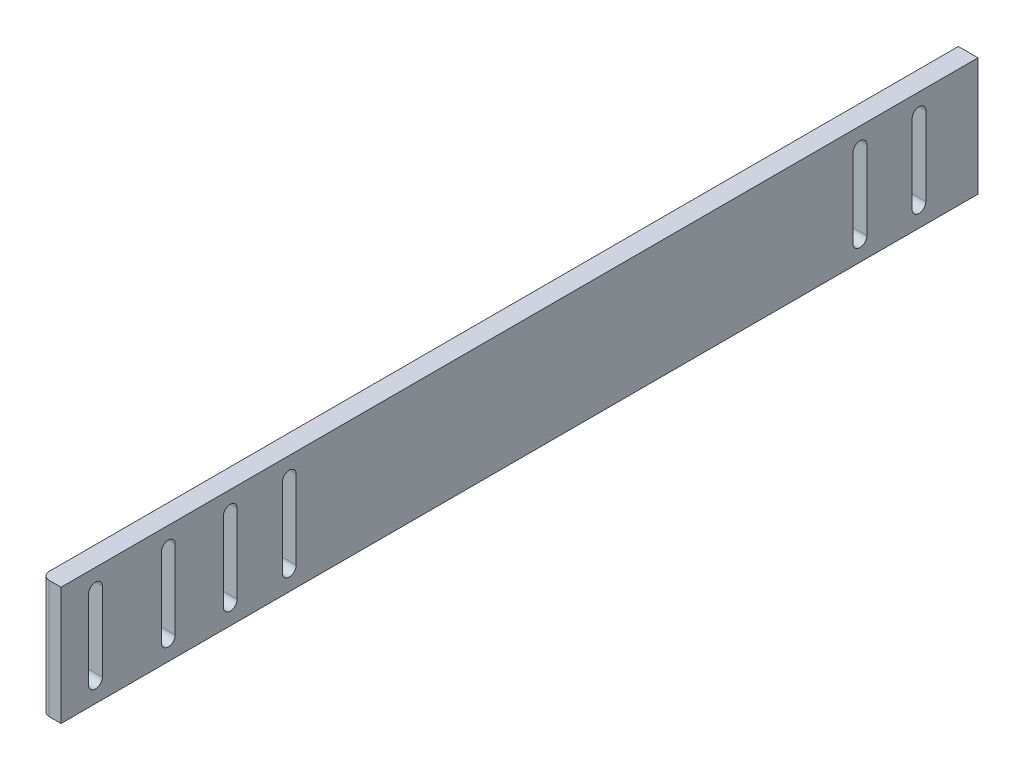
ISO-10303-21;
HEADER;
FILE_DESCRIPTION(('STEP AP214'),'2;1');
FILE_NAME('part.step','',(''),(''),'','','');
FILE_SCHEMA(('AUTOMOTIVE_DESIGN { 1 0 10303 214 1 1 1 1 }'));
ENDSEC;
DATA;
#1=APPLICATION_CONTEXT('core data for automotive mechanical design processes');
#2=APPLICATION_PROTOCOL_DEFINITION('international standard','automotive_design',2000,#1);
#3=PRODUCT_CONTEXT('',#1,'mechanical');
#4=PRODUCT('Part','Part','',(#3));
#5=PRODUCT_RELATED_PRODUCT_CATEGORY('part','',(#4));
#6=PRODUCT_DEFINITION_FORMATION('','',#4);
#7=PRODUCT_DEFINITION_CONTEXT('part definition',#1,'design');
#8=PRODUCT_DEFINITION('design','',#6,#7);
#9=PRODUCT_DEFINITION_SHAPE('','',#8);
#10=(LENGTH_UNIT() NAMED_UNIT(*) SI_UNIT(.MILLI.,.METRE.));
#11=(NAMED_UNIT(*) PLANE_ANGLE_UNIT() SI_UNIT($,.RADIAN.));
#12=(NAMED_UNIT(*) SI_UNIT($,.STERADIAN.) SOLID_ANGLE_UNIT());
#13=UNCERTAINTY_MEASURE_WITH_UNIT(LENGTH_MEASURE(1.E-05),#10,'distance_accuracy_value','');
#14=(GEOMETRIC_REPRESENTATION_CONTEXT(3) GLOBAL_UNCERTAINTY_ASSIGNED_CONTEXT((#13)) GLOBAL_UNIT_ASSIGNED_CONTEXT((#10,
#11,#12)) REPRESENTATION_CONTEXT('',''));
#15=CARTESIAN_POINT('',(0.,0.,0.));
#16=DIRECTION('',(0.,0.,1.));
#17=DIRECTION('',(1.,0.,0.));
#18=AXIS2_PLACEMENT_3D('',#15,#16,#17);
#19=CARTESIAN_POINT('',(5.,-9.99999999999988,-209.25));
#20=DIRECTION('',(-1.,0.,0.));
#21=DIRECTION('',(0.,0.,1.));
#22=AXIS2_PLACEMENT_3D('',#19,#20,#21);
#23=CYLINDRICAL_SURFACE('',#22,1.75000000000001);
#24=CARTESIAN_POINT('',(0.,-9.99999999999988,-209.25));
#25=DIRECTION('',(1.,0.,0.));
#26=DIRECTION('',(0.,0.,-1.));
#27=AXIS2_PLACEMENT_3D('',#24,#25,#26);
#28=CIRCLE('',#27,1.75000000000001);
#29=CARTESIAN_POINT('',(0.,-9.99999999999988,-207.5));
#30=VERTEX_POINT('',#29);
#31=CARTESIAN_POINT('',(0.,-9.99999999999988,-211.));
#32=VERTEX_POINT('',#31);
#33=EDGE_CURVE('E391',#30,#32,#28,.T.);
#34=ORIENTED_EDGE('',*,*,#33,.F.);
#35=DIRECTION('',(-1.,0.,0.));
#36=VECTOR('',#35,1.);
#37=CARTESIAN_POINT('',(5.,-9.99999999999988,-207.5));
#38=LINE('',#37,#36);
#39=CARTESIAN_POINT('',(5.,-9.99999999999988,-207.5));
#40=VERTEX_POINT('',#39);
#41=EDGE_CURVE('E409',#40,#30,#38,.T.);
#42=ORIENTED_EDGE('',*,*,#41,.F.);
#43=CARTESIAN_POINT('',(5.,-9.99999999999988,-209.25));
#44=DIRECTION('',(1.,0.,0.));
#45=DIRECTION('',(0.,0.,-1.));
#46=AXIS2_PLACEMENT_3D('',#43,#44,#45);
#47=CIRCLE('',#46,1.75000000000001);
#48=CARTESIAN_POINT('',(5.,-9.99999999999988,-211.));
#49=VERTEX_POINT('',#48);
#50=EDGE_CURVE('E315',#40,#49,#47,.T.);
#51=ORIENTED_EDGE('',*,*,#50,.T.);
#52=DIRECTION('',(-1.,0.,0.));
#53=VECTOR('',#52,1.);
#54=CARTESIAN_POINT('',(5.,-9.99999999999988,-211.));
#55=LINE('',#54,#53);
#56=EDGE_CURVE('E402',#49,#32,#55,.T.);
#57=ORIENTED_EDGE('',*,*,#56,.T.);
#58=EDGE_LOOP('',(#34,#42,#51,#57));
#59=FACE_BOUND('',#58,.T.);
#60=ADVANCED_FACE('F41',(#59),#23,.F.);
#61=CARTESIAN_POINT('',(5.,0.,-207.5));
#62=DIRECTION('',(0.,0.,-1.));
#63=DIRECTION('',(-1.,0.,0.));
#64=AXIS2_PLACEMENT_3D('',#61,#62,#63);
#65=PLANE('',#64);
#66=DIRECTION('',(0.,-1.,0.));
#67=VECTOR('',#66,1.);
#68=CARTESIAN_POINT('',(0.,0.,-207.5));
#69=LINE('',#68,#67);
#70=CARTESIAN_POINT('',(0.,10.0000000000001,-207.5));
#71=VERTEX_POINT('',#70);
#72=EDGE_CURVE('E394',#71,#30,#69,.T.);
#73=ORIENTED_EDGE('',*,*,#72,.F.);
#74=DIRECTION('',(-1.,0.,0.));
#75=VECTOR('',#74,1.);
#76=CARTESIAN_POINT('',(5.,10.0000000000001,-207.5));
#77=LINE('',#76,#75);
#78=CARTESIAN_POINT('',(5.,10.0000000000001,-207.5));
#79=VERTEX_POINT('',#78);
#80=EDGE_CURVE('E407',#79,#71,#77,.T.);
#81=ORIENTED_EDGE('',*,*,#80,.F.);
#82=DIRECTION('',(0.,-1.,0.));
#83=VECTOR('',#82,1.);
#84=CARTESIAN_POINT('',(5.,0.,-207.5));
#85=LINE('',#84,#83);
#86=EDGE_CURVE('E318',#79,#40,#85,.T.);
#87=ORIENTED_EDGE('',*,*,#86,.T.);
#88=ORIENTED_EDGE('',*,*,#41,.T.);
#89=EDGE_LOOP('',(#73,#81,#87,#88));
#90=FACE_BOUND('',#89,.T.);
#91=ADVANCED_FACE('F483',(#90),#65,.T.);
#92=CARTESIAN_POINT('',(5.,10.0000000000001,-209.25));
#93=DIRECTION('',(-1.,0.,0.));
#94=DIRECTION('',(0.,0.,1.));
#95=AXIS2_PLACEMENT_3D('',#92,#93,#94);
#96=CYLINDRICAL_SURFACE('',#95,1.75000000000001);
#97=CARTESIAN_POINT('',(0.,10.0000000000001,-209.25));
#98=DIRECTION('',(1.,0.,0.));
#99=DIRECTION('',(0.,0.,-1.));
#100=AXIS2_PLACEMENT_3D('',#97,#98,#99);
#101=CIRCLE('',#100,1.75000000000001);
#102=CARTESIAN_POINT('',(0.,10.0000000000001,-211.));
#103=VERTEX_POINT('',#102);
#104=EDGE_CURVE('E397',#103,#71,#101,.T.);
#105=ORIENTED_EDGE('',*,*,#104,.F.);
#106=DIRECTION('',(-1.,0.,0.));
#107=VECTOR('',#106,1.);
#108=CARTESIAN_POINT('',(5.,10.0000000000001,-211.));
#109=LINE('',#108,#107);
#110=CARTESIAN_POINT('',(5.,10.0000000000001,-211.));
#111=VERTEX_POINT('',#110);
#112=EDGE_CURVE('E404',#111,#103,#109,.T.);
#113=ORIENTED_EDGE('',*,*,#112,.F.);
#114=CARTESIAN_POINT('',(5.,10.0000000000001,-209.25));
#115=DIRECTION('',(1.,0.,0.));
#116=DIRECTION('',(0.,0.,-1.));
#117=AXIS2_PLACEMENT_3D('',#114,#115,#116);
#118=CIRCLE('',#117,1.75000000000001);
#119=EDGE_CURVE('E321',#111,#79,#118,.T.);
#120=ORIENTED_EDGE('',*,*,#119,.T.);
#121=ORIENTED_EDGE('',*,*,#80,.T.);
#122=EDGE_LOOP('',(#105,#113,#120,#121));
#123=FACE_BOUND('',#122,.T.);
#124=ADVANCED_FACE('F489',(#123),#96,.F.);
#125=CARTESIAN_POINT('',(5.,-10.,-49.25));
#126=DIRECTION('',(-1.,0.,0.));
#127=DIRECTION('',(0.,0.,1.));
#128=AXIS2_PLACEMENT_3D('',#125,#126,#127);
#129=CYLINDRICAL_SURFACE('',#128,1.75);
#130=CARTESIAN_POINT('',(0.,-10.,-49.25));
#131=DIRECTION('',(1.,0.,0.));
#132=DIRECTION('',(0.,0.,-1.));
#133=AXIS2_PLACEMENT_3D('',#130,#131,#132);
#134=CIRCLE('',#133,1.75);
#135=CARTESIAN_POINT('',(0.,-10.,-47.5));
#136=VERTEX_POINT('',#135);
#137=CARTESIAN_POINT('',(0.,-10.,-51.));
#138=VERTEX_POINT('',#137);
#139=EDGE_CURVE('E379',#136,#138,#134,.T.);
#140=ORIENTED_EDGE('',*,*,#139,.F.);
#141=DIRECTION('',(-1.,0.,0.));
#142=VECTOR('',#141,1.);
#143=CARTESIAN_POINT('',(5.,-10.,-47.5));
#144=LINE('',#143,#142);
#145=CARTESIAN_POINT('',(5.,-10.,-47.5));
#146=VERTEX_POINT('',#145);
#147=EDGE_CURVE('E405',#146,#136,#144,.T.);
#148=ORIENTED_EDGE('',*,*,#147,.F.);
#149=CARTESIAN_POINT('',(5.,-10.,-49.25));
#150=DIRECTION('',(1.,0.,0.));
#151=DIRECTION('',(0.,0.,-1.));
#152=AXIS2_PLACEMENT_3D('',#149,#150,#151);
#153=CIRCLE('',#152,1.75);
#154=CARTESIAN_POINT('',(5.,-10.,-51.));
#155=VERTEX_POINT('',#154);
#156=EDGE_CURVE('E304',#146,#155,#153,.T.);
#157=ORIENTED_EDGE('',*,*,#156,.T.);
#158=DIRECTION('',(-1.,0.,0.));
#159=VECTOR('',#158,1.);
#160=CARTESIAN_POINT('',(5.,-10.,-51.));
#161=LINE('',#160,#159);
#162=EDGE_CURVE('E412',#155,#138,#161,.T.);
#163=ORIENTED_EDGE('',*,*,#162,.T.);
#164=EDGE_LOOP('',(#140,#148,#157,#163));
#165=FACE_BOUND('',#164,.T.);
#166=ADVANCED_FACE('F509',(#165),#129,.F.);
#167=CARTESIAN_POINT('',(5.,0.,-47.5));
#168=DIRECTION('',(0.,0.,1.));
#169=DIRECTION('',(1.,0.,0.));
#170=AXIS2_PLACEMENT_3D('',#167,#168,#169);
#171=PLANE('',#170);
#172=DIRECTION('',(0.,1.,0.));
#173=VECTOR('',#172,1.);
#174=CARTESIAN_POINT('',(0.,0.,-47.5));
#175=LINE('',#174,#173);
#176=CARTESIAN_POINT('',(0.,9.99999999999996,-47.5));
#177=VERTEX_POINT('',#176);
#178=EDGE_CURVE('E382',#136,#177,#175,.T.);
#179=ORIENTED_EDGE('',*,*,#178,.T.);
#180=DIRECTION('',(-1.,0.,0.));
#181=VECTOR('',#180,1.);
#182=CARTESIAN_POINT('',(5.,9.99999999999996,-47.5));
#183=LINE('',#182,#181);
#184=CARTESIAN_POINT('',(5.,9.99999999999996,-47.5));
#185=VERTEX_POINT('',#184);
#186=EDGE_CURVE('E417',#185,#177,#183,.T.);
#187=ORIENTED_EDGE('',*,*,#186,.F.);
#188=DIRECTION('',(0.,1.,0.));
#189=VECTOR('',#188,1.);
#190=CARTESIAN_POINT('',(5.,0.,-47.5));
#191=LINE('',#190,#189);
#192=EDGE_CURVE('E307',#146,#185,#191,.T.);
#193=ORIENTED_EDGE('',*,*,#192,.F.);
#194=ORIENTED_EDGE('',*,*,#147,.T.);
#195=EDGE_LOOP('',(#179,#187,#193,#194));
#196=FACE_BOUND('',#195,.T.);
#197=ADVANCED_FACE('F505',(#196),#171,.F.);
#198=CARTESIAN_POINT('',(5.,9.99999999999996,-49.25));
#199=DIRECTION('',(-1.,0.,0.));
#200=DIRECTION('',(0.,0.,1.));
#201=AXIS2_PLACEMENT_3D('',#198,#199,#200);
#202=CYLINDRICAL_SURFACE('',#201,1.75);
#203=CARTESIAN_POINT('',(0.,9.99999999999996,-49.25));
#204=DIRECTION('',(1.,0.,0.));
#205=DIRECTION('',(0.,0.,-1.));
#206=AXIS2_PLACEMENT_3D('',#203,#204,#205);
#207=CIRCLE('',#206,1.75);
#208=CARTESIAN_POINT('',(0.,9.99999999999996,-51.));
#209=VERTEX_POINT('',#208);
#210=EDGE_CURVE('E385',#209,#177,#207,.T.);
#211=ORIENTED_EDGE('',*,*,#210,.F.);
#212=DIRECTION('',(-1.,0.,0.));
#213=VECTOR('',#212,1.);
#214=CARTESIAN_POINT('',(5.,9.99999999999996,-51.));
#215=LINE('',#214,#213);
#216=CARTESIAN_POINT('',(5.,9.99999999999996,-51.));
#217=VERTEX_POINT('',#216);
#218=EDGE_CURVE('E414',#217,#209,#215,.T.);
#219=ORIENTED_EDGE('',*,*,#218,.F.);
#220=CARTESIAN_POINT('',(5.,9.99999999999996,-49.25));
#221=DIRECTION('',(1.,0.,0.));
#222=DIRECTION('',(0.,0.,-1.));
#223=AXIS2_PLACEMENT_3D('',#220,#221,#222);
#224=CIRCLE('',#223,1.75);
#225=EDGE_CURVE('E309',#217,#185,#224,.T.);
#226=ORIENTED_EDGE('',*,*,#225,.T.);
#227=ORIENTED_EDGE('',*,*,#186,.T.);
#228=EDGE_LOOP('',(#211,#219,#226,#227));
#229=FACE_BOUND('',#228,.T.);
#230=ADVANCED_FACE('F501',(#229),#202,.F.);
#231=CARTESIAN_POINT('',(5.,-10.,-34.25));
#232=DIRECTION('',(-1.,0.,0.));
#233=DIRECTION('',(0.,0.,1.));
#234=AXIS2_PLACEMENT_3D('',#231,#232,#233);
#235=CYLINDRICAL_SURFACE('',#234,1.75);
#236=CARTESIAN_POINT('',(0.,-10.,-34.25));
#237=DIRECTION('',(1.,0.,0.));
#238=DIRECTION('',(0.,0.,-1.));
#239=AXIS2_PLACEMENT_3D('',#236,#237,#238);
#240=CIRCLE('',#239,1.75);
#241=CARTESIAN_POINT('',(0.,-10.,-32.5));
#242=VERTEX_POINT('',#241);
#243=CARTESIAN_POINT('',(0.,-10.,-36.));
#244=VERTEX_POINT('',#243);
#245=EDGE_CURVE('E367',#242,#244,#240,.T.);
#246=ORIENTED_EDGE('',*,*,#245,.F.);
#247=DIRECTION('',(-1.,0.,0.));
#248=VECTOR('',#247,1.);
#249=CARTESIAN_POINT('',(5.,-10.,-32.5));
#250=LINE('',#249,#248);
#251=CARTESIAN_POINT('',(5.,-10.,-32.5));
#252=VERTEX_POINT('',#251);
#253=EDGE_CURVE('E415',#252,#242,#250,.T.);
#254=ORIENTED_EDGE('',*,*,#253,.F.);
#255=CARTESIAN_POINT('',(5.,-10.,-34.25));
#256=DIRECTION('',(1.,0.,0.));
#257=DIRECTION('',(0.,0.,-1.));
#258=AXIS2_PLACEMENT_3D('',#255,#256,#257);
#259=CIRCLE('',#258,1.75);
#260=CARTESIAN_POINT('',(5.,-10.,-36.));
#261=VERTEX_POINT('',#260);
#262=EDGE_CURVE('E293',#252,#261,#259,.T.);
#263=ORIENTED_EDGE('',*,*,#262,.T.);
#264=DIRECTION('',(-1.,0.,0.));
#265=VECTOR('',#264,1.);
#266=CARTESIAN_POINT('',(5.,-10.,-36.));
#267=LINE('',#266,#265);
#268=EDGE_CURVE('E420',#261,#244,#267,.T.);
#269=ORIENTED_EDGE('',*,*,#268,.T.);
#270=EDGE_LOOP('',(#246,#254,#263,#269));
#271=FACE_BOUND('',#270,.T.);
#272=ADVANCED_FACE('F504',(#271),#235,.F.);
#273=CARTESIAN_POINT('',(5.,0.,-32.5));
#274=DIRECTION('',(0.,0.,1.));
#275=DIRECTION('',(1.,0.,0.));
#276=AXIS2_PLACEMENT_3D('',#273,#274,#275);
#277=PLANE('',#276);
#278=DIRECTION('',(0.,1.,0.));
#279=VECTOR('',#278,1.);
#280=CARTESIAN_POINT('',(0.,0.,-32.5));
#281=LINE('',#280,#279);
#282=CARTESIAN_POINT('',(0.,9.99999999999997,-32.5));
#283=VERTEX_POINT('',#282);
#284=EDGE_CURVE('E370',#242,#283,#281,.T.);
#285=ORIENTED_EDGE('',*,*,#284,.T.);
#286=DIRECTION('',(-1.,0.,0.));
#287=VECTOR('',#286,1.);
#288=CARTESIAN_POINT('',(5.,9.99999999999997,-32.5));
#289=LINE('',#288,#287);
#290=CARTESIAN_POINT('',(5.,9.99999999999997,-32.5));
#291=VERTEX_POINT('',#290);
#292=EDGE_CURVE('E425',#291,#283,#289,.T.);
#293=ORIENTED_EDGE('',*,*,#292,.F.);
#294=DIRECTION('',(0.,1.,0.));
#295=VECTOR('',#294,1.);
#296=CARTESIAN_POINT('',(5.,0.,-32.5));
#297=LINE('',#296,#295);
#298=EDGE_CURVE('E296',#252,#291,#297,.T.);
#299=ORIENTED_EDGE('',*,*,#298,.F.);
#300=ORIENTED_EDGE('',*,*,#253,.T.);
#301=EDGE_LOOP('',(#285,#293,#299,#300));
#302=FACE_BOUND('',#301,.T.);
#303=ADVANCED_FACE('F522',(#302),#277,.F.);
#304=CARTESIAN_POINT('',(5.,9.99999999999997,-34.25));
#305=DIRECTION('',(-1.,0.,0.));
#306=DIRECTION('',(0.,0.,1.));
#307=AXIS2_PLACEMENT_3D('',#304,#305,#306);
#308=CYLINDRICAL_SURFACE('',#307,1.75);
#309=CARTESIAN_POINT('',(0.,9.99999999999997,-34.25));
#310=DIRECTION('',(1.,0.,0.));
#311=DIRECTION('',(0.,0.,-1.));
#312=AXIS2_PLACEMENT_3D('',#309,#310,#311);
#313=CIRCLE('',#312,1.75);
#314=CARTESIAN_POINT('',(0.,9.99999999999997,-36.));
#315=VERTEX_POINT('',#314);
#316=EDGE_CURVE('E373',#315,#283,#313,.T.);
#317=ORIENTED_EDGE('',*,*,#316,.F.);
#318=DIRECTION('',(-1.,0.,0.));
#319=VECTOR('',#318,1.);
#320=CARTESIAN_POINT('',(5.,9.99999999999997,-36.));
#321=LINE('',#320,#319);
#322=CARTESIAN_POINT('',(5.,9.99999999999997,-36.));
#323=VERTEX_POINT('',#322);
#324=EDGE_CURVE('E422',#323,#315,#321,.T.);
#325=ORIENTED_EDGE('',*,*,#324,.F.);
#326=CARTESIAN_POINT('',(5.,9.99999999999997,-34.25));
#327=DIRECTION('',(1.,0.,0.));
#328=DIRECTION('',(0.,0.,-1.));
#329=AXIS2_PLACEMENT_3D('',#326,#327,#328);
#330=CIRCLE('',#329,1.75);
#331=EDGE_CURVE('E298',#323,#291,#330,.T.);
#332=ORIENTED_EDGE('',*,*,#331,.T.);
#333=ORIENTED_EDGE('',*,*,#292,.T.);
#334=EDGE_LOOP('',(#317,#325,#332,#333));
#335=FACE_BOUND('',#334,.T.);
#336=ADVANCED_FACE('F518',(#335),#308,.F.);
#337=CARTESIAN_POINT('',(5.,-9.99999999999992,-194.25));
#338=DIRECTION('',(-1.,0.,0.));
#339=DIRECTION('',(0.,0.,1.));
#340=AXIS2_PLACEMENT_3D('',#337,#338,#339);
#341=CYLINDRICAL_SURFACE('',#340,1.75000000000001);
#342=CARTESIAN_POINT('',(0.,-9.99999999999992,-194.25));
#343=DIRECTION('',(1.,0.,0.));
#344=DIRECTION('',(0.,0.,-1.));
#345=AXIS2_PLACEMENT_3D('',#342,#343,#344);
#346=CIRCLE('',#345,1.75000000000001);
#347=CARTESIAN_POINT('',(0.,-9.99999999999992,-192.5));
#348=VERTEX_POINT('',#347);
#349=CARTESIAN_POINT('',(0.,-9.99999999999992,-196.));
#350=VERTEX_POINT('',#349);
#351=EDGE_CURVE('E355',#348,#350,#346,.T.);
#352=ORIENTED_EDGE('',*,*,#351,.F.);
#353=DIRECTION('',(-1.,0.,0.));
#354=VECTOR('',#353,1.);
#355=CARTESIAN_POINT('',(5.,-9.99999999999992,-192.5));
#356=LINE('',#355,#354);
#357=CARTESIAN_POINT('',(5.,-9.99999999999992,-192.5));
#358=VERTEX_POINT('',#357);
#359=EDGE_CURVE('E423',#358,#348,#356,.T.);
#360=ORIENTED_EDGE('',*,*,#359,.F.);
#361=CARTESIAN_POINT('',(5.,-9.99999999999992,-194.25));
#362=DIRECTION('',(1.,0.,0.));
#363=DIRECTION('',(0.,0.,-1.));
#364=AXIS2_PLACEMENT_3D('',#361,#362,#363);
#365=CIRCLE('',#364,1.75000000000001);
#366=CARTESIAN_POINT('',(5.,-9.99999999999992,-196.));
#367=VERTEX_POINT('',#366);
#368=EDGE_CURVE('E282',#358,#367,#365,.T.);
#369=ORIENTED_EDGE('',*,*,#368,.T.);
#370=DIRECTION('',(-1.,0.,0.));
#371=VECTOR('',#370,1.);
#372=CARTESIAN_POINT('',(5.,-9.99999999999992,-196.));
#373=LINE('',#372,#371);
#374=EDGE_CURVE('E428',#367,#350,#373,.T.);
#375=ORIENTED_EDGE('',*,*,#374,.T.);
#376=EDGE_LOOP('',(#352,#360,#369,#375));
#377=FACE_BOUND('',#376,.T.);
#378=ADVANCED_FACE('F521',(#377),#341,.F.);
#379=CARTESIAN_POINT('',(5.,0.,-192.5));
#380=DIRECTION('',(0.,0.,1.));
#381=DIRECTION('',(1.,0.,0.));
#382=AXIS2_PLACEMENT_3D('',#379,#380,#381);
#383=PLANE('',#382);
#384=DIRECTION('',(0.,1.,0.));
#385=VECTOR('',#384,1.);
#386=CARTESIAN_POINT('',(0.,0.,-192.5));
#387=LINE('',#386,#385);
#388=CARTESIAN_POINT('',(0.,9.99999999999994,-192.5));
#389=VERTEX_POINT('',#388);
#390=EDGE_CURVE('E358',#348,#389,#387,.T.);
#391=ORIENTED_EDGE('',*,*,#390,.T.);
#392=DIRECTION('',(-1.,0.,0.));
#393=VECTOR('',#392,1.);
#394=CARTESIAN_POINT('',(5.,9.99999999999994,-192.5));
#395=LINE('',#394,#393);
#396=CARTESIAN_POINT('',(5.,9.99999999999994,-192.5));
#397=VERTEX_POINT('',#396);
#398=EDGE_CURVE('E433',#397,#389,#395,.T.);
#399=ORIENTED_EDGE('',*,*,#398,.F.);
#400=DIRECTION('',(0.,1.,0.));
#401=VECTOR('',#400,1.);
#402=CARTESIAN_POINT('',(5.,0.,-192.5));
#403=LINE('',#402,#401);
#404=EDGE_CURVE('E285',#358,#397,#403,.T.);
#405=ORIENTED_EDGE('',*,*,#404,.F.);
#406=ORIENTED_EDGE('',*,*,#359,.T.);
#407=EDGE_LOOP('',(#391,#399,#405,#406));
#408=FACE_BOUND('',#407,.T.);
#409=ADVANCED_FACE('F538',(#408),#383,.F.);
#410=CARTESIAN_POINT('',(5.,9.99999999999994,-194.25));
#411=DIRECTION('',(-1.,0.,0.));
#412=DIRECTION('',(0.,0.,1.));
#413=AXIS2_PLACEMENT_3D('',#410,#411,#412);
#414=CYLINDRICAL_SURFACE('',#413,1.75000000000001);
#415=CARTESIAN_POINT('',(0.,9.99999999999994,-194.25));
#416=DIRECTION('',(1.,0.,0.));
#417=DIRECTION('',(0.,0.,-1.));
#418=AXIS2_PLACEMENT_3D('',#415,#416,#417);
#419=CIRCLE('',#418,1.75000000000001);
#420=CARTESIAN_POINT('',(0.,9.99999999999994,-196.));
#421=VERTEX_POINT('',#420);
#422=EDGE_CURVE('E361',#421,#389,#419,.T.);
#423=ORIENTED_EDGE('',*,*,#422,.F.);
#424=DIRECTION('',(-1.,0.,0.));
#425=VECTOR('',#424,1.);
#426=CARTESIAN_POINT('',(5.,9.99999999999994,-196.));
#427=LINE('',#426,#425);
#428=CARTESIAN_POINT('',(5.,9.99999999999994,-196.));
#429=VERTEX_POINT('',#428);
#430=EDGE_CURVE('E430',#429,#421,#427,.T.);
#431=ORIENTED_EDGE('',*,*,#430,.F.);
#432=CARTESIAN_POINT('',(5.,9.99999999999994,-194.25));
#433=DIRECTION('',(1.,0.,0.));
#434=DIRECTION('',(0.,0.,-1.));
#435=AXIS2_PLACEMENT_3D('',#432,#433,#434);
#436=CIRCLE('',#435,1.75000000000001);
#437=EDGE_CURVE('E287',#429,#397,#436,.T.);
#438=ORIENTED_EDGE('',*,*,#437,.T.);
#439=ORIENTED_EDGE('',*,*,#398,.T.);
#440=EDGE_LOOP('',(#423,#431,#438,#439));
#441=FACE_BOUND('',#440,.T.);
#442=ADVANCED_FACE('F534',(#441),#414,.F.);
#443=CARTESIAN_POINT('',(5.,-10.,-18.5));
#444=DIRECTION('',(-1.,0.,0.));
#445=DIRECTION('',(0.,0.,1.));
#446=AXIS2_PLACEMENT_3D('',#443,#444,#445);
#447=CYLINDRICAL_SURFACE('',#446,1.75);
#448=CARTESIAN_POINT('',(0.,-10.,-18.5));
#449=DIRECTION('',(1.,0.,0.));
#450=DIRECTION('',(0.,0.,-1.));
#451=AXIS2_PLACEMENT_3D('',#448,#449,#450);
#452=CIRCLE('',#451,1.75);
#453=CARTESIAN_POINT('',(0.,-10.,-16.75));
#454=VERTEX_POINT('',#453);
#455=CARTESIAN_POINT('',(0.,-10.,-20.25));
#456=VERTEX_POINT('',#455);
#457=EDGE_CURVE('E343',#454,#456,#452,.T.);
#458=ORIENTED_EDGE('',*,*,#457,.F.);
#459=DIRECTION('',(-1.,0.,0.));
#460=VECTOR('',#459,1.);
#461=CARTESIAN_POINT('',(5.,-10.,-16.75));
#462=LINE('',#461,#460);
#463=CARTESIAN_POINT('',(5.,-10.,-16.75));
#464=VERTEX_POINT('',#463);
#465=EDGE_CURVE('E431',#464,#454,#462,.T.);
#466=ORIENTED_EDGE('',*,*,#465,.F.);
#467=CARTESIAN_POINT('',(5.,-10.,-18.5));
#468=DIRECTION('',(1.,0.,0.));
#469=DIRECTION('',(0.,0.,-1.));
#470=AXIS2_PLACEMENT_3D('',#467,#468,#469);
#471=CIRCLE('',#470,1.75);
#472=CARTESIAN_POINT('',(5.,-10.,-20.25));
#473=VERTEX_POINT('',#472);
#474=EDGE_CURVE('E271',#464,#473,#471,.T.);
#475=ORIENTED_EDGE('',*,*,#474,.T.);
#476=DIRECTION('',(-1.,0.,0.));
#477=VECTOR('',#476,1.);
#478=CARTESIAN_POINT('',(5.,-10.,-20.25));
#479=LINE('',#478,#477);
#480=EDGE_CURVE('E436',#473,#456,#479,.T.);
#481=ORIENTED_EDGE('',*,*,#480,.T.);
#482=EDGE_LOOP('',(#458,#466,#475,#481));
#483=FACE_BOUND('',#482,.T.);
#484=ADVANCED_FACE('F537',(#483),#447,.F.);
#485=CARTESIAN_POINT('',(5.,0.,-16.75));
#486=DIRECTION('',(0.,0.,1.));
#487=DIRECTION('',(1.,0.,0.));
#488=AXIS2_PLACEMENT_3D('',#485,#486,#487);
#489=PLANE('',#488);
#490=DIRECTION('',(0.,1.,0.));
#491=VECTOR('',#490,1.);
#492=CARTESIAN_POINT('',(0.,0.,-16.75));
#493=LINE('',#492,#491);
#494=CARTESIAN_POINT('',(0.,9.99999999999999,-16.75));
#495=VERTEX_POINT('',#494);
#496=EDGE_CURVE('E346',#454,#495,#493,.T.);
#497=ORIENTED_EDGE('',*,*,#496,.T.);
#498=DIRECTION('',(-1.,0.,0.));
#499=VECTOR('',#498,1.);
#500=CARTESIAN_POINT('',(5.,9.99999999999999,-16.75));
#501=LINE('',#500,#499);
#502=CARTESIAN_POINT('',(5.,9.99999999999999,-16.75));
#503=VERTEX_POINT('',#502);
#504=EDGE_CURVE('E441',#503,#495,#501,.T.);
#505=ORIENTED_EDGE('',*,*,#504,.F.);
#506=DIRECTION('',(0.,1.,0.));
#507=VECTOR('',#506,1.);
#508=CARTESIAN_POINT('',(5.,0.,-16.75));
#509=LINE('',#508,#507);
#510=EDGE_CURVE('E274',#464,#503,#509,.T.);
#511=ORIENTED_EDGE('',*,*,#510,.F.);
#512=ORIENTED_EDGE('',*,*,#465,.T.);
#513=EDGE_LOOP('',(#497,#505,#511,#512));
#514=FACE_BOUND('',#513,.T.);
#515=ADVANCED_FACE('F552',(#514),#489,.F.);
#516=CARTESIAN_POINT('',(5.,9.99999999999999,-18.5));
#517=DIRECTION('',(-1.,0.,0.));
#518=DIRECTION('',(0.,0.,1.));
#519=AXIS2_PLACEMENT_3D('',#516,#517,#518);
#520=CYLINDRICAL_SURFACE('',#519,1.75);
#521=CARTESIAN_POINT('',(0.,9.99999999999999,-18.5));
#522=DIRECTION('',(1.,0.,0.));
#523=DIRECTION('',(0.,0.,-1.));
#524=AXIS2_PLACEMENT_3D('',#521,#522,#523);
#525=CIRCLE('',#524,1.75);
#526=CARTESIAN_POINT('',(0.,9.99999999999999,-20.25));
#527=VERTEX_POINT('',#526);
#528=EDGE_CURVE('E349',#527,#495,#525,.T.);
#529=ORIENTED_EDGE('',*,*,#528,.F.);
#530=DIRECTION('',(-1.,0.,0.));
#531=VECTOR('',#530,1.);
#532=CARTESIAN_POINT('',(5.,9.99999999999999,-20.25));
#533=LINE('',#532,#531);
#534=CARTESIAN_POINT('',(5.,9.99999999999999,-20.25));
#535=VERTEX_POINT('',#534);
#536=EDGE_CURVE('E438',#535,#527,#533,.T.);
#537=ORIENTED_EDGE('',*,*,#536,.F.);
#538=CARTESIAN_POINT('',(5.,9.99999999999999,-18.5));
#539=DIRECTION('',(1.,0.,0.));
#540=DIRECTION('',(0.,0.,-1.));
#541=AXIS2_PLACEMENT_3D('',#538,#539,#540);
#542=CIRCLE('',#541,1.75);
#543=EDGE_CURVE('E276',#535,#503,#542,.T.);
#544=ORIENTED_EDGE('',*,*,#543,.T.);
#545=ORIENTED_EDGE('',*,*,#504,.T.);
#546=EDGE_LOOP('',(#529,#537,#544,#545));
#547=FACE_BOUND('',#546,.T.);
#548=ADVANCED_FACE('F549',(#547),#520,.F.);
#549=CARTESIAN_POINT('',(5.,-15.,0.));
#550=DIRECTION('',(0.,1.,0.));
#551=DIRECTION('',(0.,0.,1.));
#552=AXIS2_PLACEMENT_3D('',#549,#550,#551);
#553=PLANE('',#552);
#554=DIRECTION('',(-1.,0.,0.));
#555=VECTOR('',#554,1.);
#556=CARTESIAN_POINT('',(5.,-15.,8.74999999999999));
#557=LINE('',#556,#555);
#558=CARTESIAN_POINT('',(5.,-15.,8.74999999999999));
#559=VERTEX_POINT('',#558);
#560=CARTESIAN_POINT('',(2.,-15.,8.74999999999999));
#561=VERTEX_POINT('',#560);
#562=EDGE_CURVE('E240',#559,#561,#557,.T.);
#563=ORIENTED_EDGE('',*,*,#562,.T.);
#564=CARTESIAN_POINT('',(2.,-15.,6.74999999999999));
#565=DIRECTION('',(0.,1.,0.));
#566=DIRECTION('',(0.,0.,1.));
#567=AXIS2_PLACEMENT_3D('',#564,#565,#566);
#568=CIRCLE('',#567,2.);
#569=CARTESIAN_POINT('',(0.,-15.,6.74999999999999));
#570=VERTEX_POINT('',#569);
#571=EDGE_CURVE('E63',#561,#570,#568,.F.);
#572=ORIENTED_EDGE('',*,*,#571,.T.);
#573=DIRECTION('',(0.,0.,-1.));
#574=VECTOR('',#573,1.);
#575=CARTESIAN_POINT('',(0.,-15.,0.));
#576=LINE('',#575,#574);
#577=CARTESIAN_POINT('',(0.,-15.,-224.25));
#578=VERTEX_POINT('',#577);
#579=EDGE_CURVE('E336',#570,#578,#576,.T.);
#580=ORIENTED_EDGE('',*,*,#579,.T.);
#581=DIRECTION('',(-1.,0.,0.));
#582=VECTOR('',#581,1.);
#583=CARTESIAN_POINT('',(5.,-15.,-224.25));
#584=LINE('',#583,#582);
#585=CARTESIAN_POINT('',(5.,-15.,-224.25));
#586=VERTEX_POINT('',#585);
#587=EDGE_CURVE('E439',#586,#578,#584,.T.);
#588=ORIENTED_EDGE('',*,*,#587,.F.);
#589=DIRECTION('',(0.,0.,-1.));
#590=VECTOR('',#589,1.);
#591=CARTESIAN_POINT('',(5.,-15.,0.));
#592=LINE('',#591,#590);
#593=EDGE_CURVE('E261',#559,#586,#592,.T.);
#594=ORIENTED_EDGE('',*,*,#593,.F.);
#595=EDGE_LOOP('',(#563,#572,#580,#588,#594));
#596=FACE_BOUND('',#595,.T.);
#597=ADVANCED_FACE('F467',(#596),#553,.F.);
#598=CARTESIAN_POINT('',(5.,0.,-224.25));
#599=DIRECTION('',(0.,0.,-1.));
#600=DIRECTION('',(-1.,0.,0.));
#601=AXIS2_PLACEMENT_3D('',#598,#599,#600);
#602=PLANE('',#601);
#603=DIRECTION('',(0.,-1.,0.));
#604=VECTOR('',#603,1.);
#605=CARTESIAN_POINT('',(0.,0.,-224.25));
#606=LINE('',#605,#604);
#607=CARTESIAN_POINT('',(0.,15.,-224.25));
#608=VERTEX_POINT('',#607);
#609=EDGE_CURVE('E338',#608,#578,#606,.T.);
#610=ORIENTED_EDGE('',*,*,#609,.F.);
#611=DIRECTION('',(-1.,0.,0.));
#612=VECTOR('',#611,1.);
#613=CARTESIAN_POINT('',(5.,15.,-224.25));
#614=LINE('',#613,#612);
#615=CARTESIAN_POINT('',(5.,15.,-224.25));
#616=VERTEX_POINT('',#615);
#617=EDGE_CURVE('E448',#616,#608,#614,.T.);
#618=ORIENTED_EDGE('',*,*,#617,.F.);
#619=DIRECTION('',(0.,-1.,0.));
#620=VECTOR('',#619,1.);
#621=CARTESIAN_POINT('',(5.,0.,-224.25));
#622=LINE('',#621,#620);
#623=EDGE_CURVE('E263',#616,#586,#622,.T.);
#624=ORIENTED_EDGE('',*,*,#623,.T.);
#625=ORIENTED_EDGE('',*,*,#587,.T.);
#626=EDGE_LOOP('',(#610,#618,#624,#625));
#627=FACE_BOUND('',#626,.T.);
#628=ADVANCED_FACE('F565',(#627),#602,.T.);
#629=CARTESIAN_POINT('',(5.,15.,0.));
#630=DIRECTION('',(0.,1.,0.));
#631=DIRECTION('',(0.,0.,1.));
#632=AXIS2_PLACEMENT_3D('',#629,#630,#631);
#633=PLANE('',#632);
#634=DIRECTION('',(0.,0.,-1.));
#635=VECTOR('',#634,1.);
#636=CARTESIAN_POINT('',(0.,15.,0.));
#637=LINE('',#636,#635);
#638=CARTESIAN_POINT('',(0.,15.,6.75));
#639=VERTEX_POINT('',#638);
#640=EDGE_CURVE('E341',#639,#608,#637,.T.);
#641=ORIENTED_EDGE('',*,*,#640,.F.);
#642=CARTESIAN_POINT('',(2.,15.,6.75));
#643=DIRECTION('',(0.,1.,0.));
#644=DIRECTION('',(0.,0.,1.));
#645=AXIS2_PLACEMENT_3D('',#642,#643,#644);
#646=CIRCLE('',#645,2.);
#647=CARTESIAN_POINT('',(2.,15.,8.75));
#648=VERTEX_POINT('',#647);
#649=EDGE_CURVE('E11',#639,#648,#646,.T.);
#650=ORIENTED_EDGE('',*,*,#649,.T.);
#651=DIRECTION('',(-1.,0.,0.));
#652=VECTOR('',#651,1.);
#653=CARTESIAN_POINT('',(5.,15.,8.75));
#654=LINE('',#653,#652);
#655=CARTESIAN_POINT('',(5.,15.,8.75));
#656=VERTEX_POINT('',#655);
#657=EDGE_CURVE('E445',#656,#648,#654,.T.);
#658=ORIENTED_EDGE('',*,*,#657,.F.);
#659=DIRECTION('',(0.,0.,-1.));
#660=VECTOR('',#659,1.);
#661=CARTESIAN_POINT('',(5.,15.,0.));
#662=LINE('',#661,#660);
#663=EDGE_CURVE('E266',#656,#616,#662,.T.);
#664=ORIENTED_EDGE('',*,*,#663,.T.);
#665=ORIENTED_EDGE('',*,*,#617,.T.);
#666=EDGE_LOOP('',(#641,#650,#658,#664,#665));
#667=FACE_BOUND('',#666,.T.);
#668=ADVANCED_FACE('F473',(#667),#633,.T.);
#669=CARTESIAN_POINT('',(5.,-10.,0.));
#670=DIRECTION('',(-1.,0.,0.));
#671=DIRECTION('',(0.,0.,1.));
#672=AXIS2_PLACEMENT_3D('',#669,#670,#671);
#673=CYLINDRICAL_SURFACE('',#672,1.75);
#674=CARTESIAN_POINT('',(0.,-10.,0.));
#675=DIRECTION('',(1.,0.,0.));
#676=DIRECTION('',(0.,0.,-1.));
#677=AXIS2_PLACEMENT_3D('',#674,#675,#676);
#678=CIRCLE('',#677,1.75);
#679=CARTESIAN_POINT('',(0.,-10.,1.75));
#680=VERTEX_POINT('',#679);
#681=CARTESIAN_POINT('',(0.,-10.,-1.75));
#682=VERTEX_POINT('',#681);
#683=EDGE_CURVE('E235',#680,#682,#678,.T.);
#684=ORIENTED_EDGE('',*,*,#683,.F.);
#685=DIRECTION('',(-1.,0.,0.));
#686=VECTOR('',#685,1.);
#687=CARTESIAN_POINT('',(5.,-10.,1.75));
#688=LINE('',#687,#686);
#689=CARTESIAN_POINT('',(5.,-10.,1.75));
#690=VERTEX_POINT('',#689);
#691=EDGE_CURVE('E230',#690,#680,#688,.T.);
#692=ORIENTED_EDGE('',*,*,#691,.F.);
#693=CARTESIAN_POINT('',(5.,-10.,0.));
#694=DIRECTION('',(1.,0.,0.));
#695=DIRECTION('',(0.,0.,-1.));
#696=AXIS2_PLACEMENT_3D('',#693,#694,#695);
#697=CIRCLE('',#696,1.75);
#698=CARTESIAN_POINT('',(5.,-10.,-1.75));
#699=VERTEX_POINT('',#698);
#700=EDGE_CURVE('E233',#690,#699,#697,.T.);
#701=ORIENTED_EDGE('',*,*,#700,.T.);
#702=DIRECTION('',(-1.,0.,0.));
#703=VECTOR('',#702,1.);
#704=CARTESIAN_POINT('',(5.,-10.,-1.75));
#705=LINE('',#704,#703);
#706=EDGE_CURVE('E326',#699,#682,#705,.T.);
#707=ORIENTED_EDGE('',*,*,#706,.T.);
#708=EDGE_LOOP('',(#684,#692,#701,#707));
#709=FACE_BOUND('',#708,.T.);
#710=ADVANCED_FACE('F232',(#709),#673,.F.);
#711=CARTESIAN_POINT('',(5.,0.,1.75));
#712=DIRECTION('',(0.,0.,-1.));
#713=DIRECTION('',(0.,1.,0.));
#714=AXIS2_PLACEMENT_3D('',#711,#712,#713);
#715=PLANE('',#714);
#716=DIRECTION('',(0.,-1.,0.));
#717=VECTOR('',#716,1.);
#718=CARTESIAN_POINT('',(0.,0.,1.75));
#719=LINE('',#718,#717);
#720=CARTESIAN_POINT('',(0.,9.99999999999999,1.75));
#721=VERTEX_POINT('',#720);
#722=EDGE_CURVE('E328',#721,#680,#719,.T.);
#723=ORIENTED_EDGE('',*,*,#722,.F.);
#724=DIRECTION('',(-1.,0.,0.));
#725=VECTOR('',#724,1.);
#726=CARTESIAN_POINT('',(5.,9.99999999999999,1.75));
#727=LINE('',#726,#725);
#728=CARTESIAN_POINT('',(5.,9.99999999999999,1.75));
#729=VERTEX_POINT('',#728);
#730=EDGE_CURVE('E241',#729,#721,#727,.T.);
#731=ORIENTED_EDGE('',*,*,#730,.F.);
#732=DIRECTION('',(0.,-1.,0.));
#733=VECTOR('',#732,1.);
#734=CARTESIAN_POINT('',(5.,0.,1.75));
#735=LINE('',#734,#733);
#736=EDGE_CURVE('E248',#729,#690,#735,.T.);
#737=ORIENTED_EDGE('',*,*,#736,.T.);
#738=ORIENTED_EDGE('',*,*,#691,.T.);
#739=EDGE_LOOP('',(#723,#731,#737,#738));
#740=FACE_BOUND('',#739,.T.);
#741=ADVANCED_FACE('F255',(#740),#715,.T.);
#742=CARTESIAN_POINT('',(5.,9.99999999999999,0.));
#743=DIRECTION('',(-1.,0.,0.));
#744=DIRECTION('',(0.,0.,1.));
#745=AXIS2_PLACEMENT_3D('',#742,#743,#744);
#746=CYLINDRICAL_SURFACE('',#745,1.75);
#747=CARTESIAN_POINT('',(0.,9.99999999999999,0.));
#748=DIRECTION('',(1.,0.,0.));
#749=DIRECTION('',(0.,0.,-1.));
#750=AXIS2_PLACEMENT_3D('',#747,#748,#749);
#751=CIRCLE('',#750,1.75);
#752=CARTESIAN_POINT('',(0.,9.99999999999999,-1.75));
#753=VERTEX_POINT('',#752);
#754=EDGE_CURVE('E330',#753,#721,#751,.T.);
#755=ORIENTED_EDGE('',*,*,#754,.F.);
#756=DIRECTION('',(-1.,0.,0.));
#757=VECTOR('',#756,1.);
#758=CARTESIAN_POINT('',(5.,9.99999999999999,-1.75));
#759=LINE('',#758,#757);
#760=CARTESIAN_POINT('',(5.,9.99999999999999,-1.75));
#761=VERTEX_POINT('',#760);
#762=EDGE_CURVE('E454',#761,#753,#759,.T.);
#763=ORIENTED_EDGE('',*,*,#762,.F.);
#764=CARTESIAN_POINT('',(5.,9.99999999999999,0.));
#765=DIRECTION('',(1.,0.,0.));
#766=DIRECTION('',(0.,0.,-1.));
#767=AXIS2_PLACEMENT_3D('',#764,#765,#766);
#768=CIRCLE('',#767,1.75);
#769=EDGE_CURVE('E256',#761,#729,#768,.T.);
#770=ORIENTED_EDGE('',*,*,#769,.T.);
#771=ORIENTED_EDGE('',*,*,#730,.T.);
#772=EDGE_LOOP('',(#755,#763,#770,#771));
#773=FACE_BOUND('',#772,.T.);
#774=ADVANCED_FACE('F499',(#773),#746,.F.);
#775=CARTESIAN_POINT('',(5.,0.,-51.));
#776=DIRECTION('',(0.,0.,1.));
#777=DIRECTION('',(0.,-1.,0.));
#778=AXIS2_PLACEMENT_3D('',#775,#776,#777);
#779=PLANE('',#778);
#780=DIRECTION('',(0.,1.,0.));
#781=VECTOR('',#780,1.);
#782=CARTESIAN_POINT('',(0.,0.,-51.));
#783=LINE('',#782,#781);
#784=EDGE_CURVE('E388',#138,#209,#783,.T.);
#785=ORIENTED_EDGE('',*,*,#784,.F.);
#786=ORIENTED_EDGE('',*,*,#162,.F.);
#787=DIRECTION('',(0.,1.,0.));
#788=VECTOR('',#787,1.);
#789=CARTESIAN_POINT('',(5.,0.,-51.));
#790=LINE('',#789,#788);
#791=EDGE_CURVE('E312',#155,#217,#790,.T.);
#792=ORIENTED_EDGE('',*,*,#791,.T.);
#793=ORIENTED_EDGE('',*,*,#218,.T.);
#794=EDGE_LOOP('',(#785,#786,#792,#793));
#795=FACE_BOUND('',#794,.T.);
#796=ADVANCED_FACE('F495',(#795),#779,.T.);
#797=CARTESIAN_POINT('',(5.,0.,-36.));
#798=DIRECTION('',(0.,0.,1.));
#799=DIRECTION('',(0.,-1.,0.));
#800=AXIS2_PLACEMENT_3D('',#797,#798,#799);
#801=PLANE('',#800);
#802=DIRECTION('',(0.,1.,0.));
#803=VECTOR('',#802,1.);
#804=CARTESIAN_POINT('',(0.,0.,-36.));
#805=LINE('',#804,#803);
#806=EDGE_CURVE('E376',#244,#315,#805,.T.);
#807=ORIENTED_EDGE('',*,*,#806,.F.);
#808=ORIENTED_EDGE('',*,*,#268,.F.);
#809=DIRECTION('',(0.,1.,0.));
#810=VECTOR('',#809,1.);
#811=CARTESIAN_POINT('',(5.,0.,-36.));
#812=LINE('',#811,#810);
#813=EDGE_CURVE('E301',#261,#323,#812,.T.);
#814=ORIENTED_EDGE('',*,*,#813,.T.);
#815=ORIENTED_EDGE('',*,*,#324,.T.);
#816=EDGE_LOOP('',(#807,#808,#814,#815));
#817=FACE_BOUND('',#816,.T.);
#818=ADVANCED_FACE('F498',(#817),#801,.T.);
#819=CARTESIAN_POINT('',(5.,0.,-196.));
#820=DIRECTION('',(0.,0.,1.));
#821=DIRECTION('',(1.,0.,0.));
#822=AXIS2_PLACEMENT_3D('',#819,#820,#821);
#823=PLANE('',#822);
#824=DIRECTION('',(0.,1.,0.));
#825=VECTOR('',#824,1.);
#826=CARTESIAN_POINT('',(0.,0.,-196.));
#827=LINE('',#826,#825);
#828=EDGE_CURVE('E364',#350,#421,#827,.T.);
#829=ORIENTED_EDGE('',*,*,#828,.F.);
#830=ORIENTED_EDGE('',*,*,#374,.F.);
#831=DIRECTION('',(0.,1.,0.));
#832=VECTOR('',#831,1.);
#833=CARTESIAN_POINT('',(5.,0.,-196.));
#834=LINE('',#833,#832);
#835=EDGE_CURVE('E290',#367,#429,#834,.T.);
#836=ORIENTED_EDGE('',*,*,#835,.T.);
#837=ORIENTED_EDGE('',*,*,#430,.T.);
#838=EDGE_LOOP('',(#829,#830,#836,#837));
#839=FACE_BOUND('',#838,.T.);
#840=ADVANCED_FACE('F516',(#839),#823,.T.);
#841=CARTESIAN_POINT('',(5.,0.,-20.25));
#842=DIRECTION('',(0.,0.,1.));
#843=DIRECTION('',(1.,0.,0.));
#844=AXIS2_PLACEMENT_3D('',#841,#842,#843);
#845=PLANE('',#844);
#846=DIRECTION('',(0.,1.,0.));
#847=VECTOR('',#846,1.);
#848=CARTESIAN_POINT('',(0.,0.,-20.25));
#849=LINE('',#848,#847);
#850=EDGE_CURVE('E352',#456,#527,#849,.T.);
#851=ORIENTED_EDGE('',*,*,#850,.F.);
#852=ORIENTED_EDGE('',*,*,#480,.F.);
#853=DIRECTION('',(0.,1.,0.));
#854=VECTOR('',#853,1.);
#855=CARTESIAN_POINT('',(5.,0.,-20.25));
#856=LINE('',#855,#854);
#857=EDGE_CURVE('E279',#473,#535,#856,.T.);
#858=ORIENTED_EDGE('',*,*,#857,.T.);
#859=ORIENTED_EDGE('',*,*,#536,.T.);
#860=EDGE_LOOP('',(#851,#852,#858,#859));
#861=FACE_BOUND('',#860,.T.);
#862=ADVANCED_FACE('F532',(#861),#845,.T.);
#863=CARTESIAN_POINT('',(5.,0.,8.75));
#864=DIRECTION('',(0.,0.,-1.));
#865=DIRECTION('',(0.,1.,0.));
#866=AXIS2_PLACEMENT_3D('',#863,#864,#865);
#867=PLANE('',#866);
#868=ORIENTED_EDGE('',*,*,#657,.T.);
#869=DIRECTION('',(0.,-1.,0.));
#870=VECTOR('',#869,1.);
#871=CARTESIAN_POINT('',(2.,0.,8.75));
#872=LINE('',#871,#870);
#873=EDGE_CURVE('E411',#648,#561,#872,.T.);
#874=ORIENTED_EDGE('',*,*,#873,.T.);
#875=ORIENTED_EDGE('',*,*,#562,.F.);
#876=DIRECTION('',(0.,-1.,0.));
#877=VECTOR('',#876,1.);
#878=CARTESIAN_POINT('',(5.,0.,8.75));
#879=LINE('',#878,#877);
#880=EDGE_CURVE('E269',#656,#559,#879,.T.);
#881=ORIENTED_EDGE('',*,*,#880,.F.);
#882=EDGE_LOOP('',(#868,#874,#875,#881));
#883=FACE_BOUND('',#882,.T.);
#884=ADVANCED_FACE('F462',(#883),#867,.F.);
#885=CARTESIAN_POINT('',(5.,0.,-1.75));
#886=DIRECTION('',(0.,0.,-1.));
#887=DIRECTION('',(0.,1.,0.));
#888=AXIS2_PLACEMENT_3D('',#885,#886,#887);
#889=PLANE('',#888);
#890=DIRECTION('',(0.,-1.,0.));
#891=VECTOR('',#890,1.);
#892=CARTESIAN_POINT('',(0.,0.,-1.75));
#893=LINE('',#892,#891);
#894=EDGE_CURVE('E333',#753,#682,#893,.T.);
#895=ORIENTED_EDGE('',*,*,#894,.T.);
#896=ORIENTED_EDGE('',*,*,#706,.F.);
#897=DIRECTION('',(0.,-1.,0.));
#898=VECTOR('',#897,1.);
#899=CARTESIAN_POINT('',(5.,0.,-1.75));
#900=LINE('',#899,#898);
#901=EDGE_CURVE('E251',#761,#699,#900,.T.);
#902=ORIENTED_EDGE('',*,*,#901,.F.);
#903=ORIENTED_EDGE('',*,*,#762,.T.);
#904=EDGE_LOOP('',(#895,#896,#902,#903));
#905=FACE_BOUND('',#904,.T.);
#906=ADVANCED_FACE('F562',(#905),#889,.F.);
#907=CARTESIAN_POINT('',(5.,0.,-211.));
#908=DIRECTION('',(0.,0.,-1.));
#909=DIRECTION('',(-1.,0.,0.));
#910=AXIS2_PLACEMENT_3D('',#907,#908,#909);
#911=PLANE('',#910);
#912=DIRECTION('',(0.,-1.,0.));
#913=VECTOR('',#912,1.);
#914=CARTESIAN_POINT('',(0.,0.,-211.));
#915=LINE('',#914,#913);
#916=EDGE_CURVE('E253',#103,#32,#915,.T.);
#917=ORIENTED_EDGE('',*,*,#916,.T.);
#918=ORIENTED_EDGE('',*,*,#56,.F.);
#919=DIRECTION('',(0.,-1.,0.));
#920=VECTOR('',#919,1.);
#921=CARTESIAN_POINT('',(5.,0.,-211.));
#922=LINE('',#921,#920);
#923=EDGE_CURVE('E324',#111,#49,#922,.T.);
#924=ORIENTED_EDGE('',*,*,#923,.F.);
#925=ORIENTED_EDGE('',*,*,#112,.T.);
#926=EDGE_LOOP('',(#917,#918,#924,#925));
#927=FACE_BOUND('',#926,.T.);
#928=ADVANCED_FACE('F573',(#927),#911,.F.);
#929=CARTESIAN_POINT('',(5.,0.,0.));
#930=DIRECTION('',(1.,0.,0.));
#931=DIRECTION('',(0.,0.,-1.));
#932=AXIS2_PLACEMENT_3D('',#929,#930,#931);
#933=PLANE('',#932);
#934=ORIENTED_EDGE('',*,*,#700,.F.);
#935=ORIENTED_EDGE('',*,*,#736,.F.);
#936=ORIENTED_EDGE('',*,*,#769,.F.);
#937=ORIENTED_EDGE('',*,*,#901,.T.);
#938=EDGE_LOOP('',(#934,#935,#936,#937));
#939=FACE_BOUND('',#938,.T.);
#940=ORIENTED_EDGE('',*,*,#593,.T.);
#941=ORIENTED_EDGE('',*,*,#623,.F.);
#942=ORIENTED_EDGE('',*,*,#663,.F.);
#943=ORIENTED_EDGE('',*,*,#880,.T.);
#944=EDGE_LOOP('',(#940,#941,#942,#943));
#945=FACE_BOUND('',#944,.T.);
#946=ORIENTED_EDGE('',*,*,#474,.F.);
#947=ORIENTED_EDGE('',*,*,#510,.T.);
#948=ORIENTED_EDGE('',*,*,#543,.F.);
#949=ORIENTED_EDGE('',*,*,#857,.F.);
#950=EDGE_LOOP('',(#946,#947,#948,#949));
#951=FACE_BOUND('',#950,.T.);
#952=ORIENTED_EDGE('',*,*,#368,.F.);
#953=ORIENTED_EDGE('',*,*,#404,.T.);
#954=ORIENTED_EDGE('',*,*,#437,.F.);
#955=ORIENTED_EDGE('',*,*,#835,.F.);
#956=EDGE_LOOP('',(#952,#953,#954,#955));
#957=FACE_BOUND('',#956,.T.);
#958=ORIENTED_EDGE('',*,*,#262,.F.);
#959=ORIENTED_EDGE('',*,*,#298,.T.);
#960=ORIENTED_EDGE('',*,*,#331,.F.);
#961=ORIENTED_EDGE('',*,*,#813,.F.);
#962=EDGE_LOOP('',(#958,#959,#960,#961));
#963=FACE_BOUND('',#962,.T.);
#964=ORIENTED_EDGE('',*,*,#156,.F.);
#965=ORIENTED_EDGE('',*,*,#192,.T.);
#966=ORIENTED_EDGE('',*,*,#225,.F.);
#967=ORIENTED_EDGE('',*,*,#791,.F.);
#968=EDGE_LOOP('',(#964,#965,#966,#967));
#969=FACE_BOUND('',#968,.T.);
#970=ORIENTED_EDGE('',*,*,#50,.F.);
#971=ORIENTED_EDGE('',*,*,#86,.F.);
#972=ORIENTED_EDGE('',*,*,#119,.F.);
#973=ORIENTED_EDGE('',*,*,#923,.T.);
#974=EDGE_LOOP('',(#970,#971,#972,#973));
#975=FACE_BOUND('',#974,.T.);
#976=ADVANCED_FACE('F245',(#939,#945,#951,#957,#963,#969,#975),#933,.T.);
#977=CARTESIAN_POINT('',(0.,0.,0.));
#978=DIRECTION('',(1.,0.,0.));
#979=DIRECTION('',(0.,0.,-1.));
#980=AXIS2_PLACEMENT_3D('',#977,#978,#979);
#981=PLANE('',#980);
#982=ORIENTED_EDGE('',*,*,#683,.T.);
#983=ORIENTED_EDGE('',*,*,#894,.F.);
#984=ORIENTED_EDGE('',*,*,#754,.T.);
#985=ORIENTED_EDGE('',*,*,#722,.T.);
#986=EDGE_LOOP('',(#982,#983,#984,#985));
#987=FACE_BOUND('',#986,.T.);
#988=ORIENTED_EDGE('',*,*,#579,.F.);
#989=DIRECTION('',(0.,-1.,0.));
#990=VECTOR('',#989,1.);
#991=CARTESIAN_POINT('',(0.,0.,6.75));
#992=LINE('',#991,#990);
#993=EDGE_CURVE('E49',#570,#639,#992,.F.);
#994=ORIENTED_EDGE('',*,*,#993,.T.);
#995=ORIENTED_EDGE('',*,*,#640,.T.);
#996=ORIENTED_EDGE('',*,*,#609,.T.);
#997=EDGE_LOOP('',(#988,#994,#995,#996));
#998=FACE_BOUND('',#997,.T.);
#999=ORIENTED_EDGE('',*,*,#457,.T.);
#1000=ORIENTED_EDGE('',*,*,#850,.T.);
#1001=ORIENTED_EDGE('',*,*,#528,.T.);
#1002=ORIENTED_EDGE('',*,*,#496,.F.);
#1003=EDGE_LOOP('',(#999,#1000,#1001,#1002));
#1004=FACE_BOUND('',#1003,.T.);
#1005=ORIENTED_EDGE('',*,*,#351,.T.);
#1006=ORIENTED_EDGE('',*,*,#828,.T.);
#1007=ORIENTED_EDGE('',*,*,#422,.T.);
#1008=ORIENTED_EDGE('',*,*,#390,.F.);
#1009=EDGE_LOOP('',(#1005,#1006,#1007,#1008));
#1010=FACE_BOUND('',#1009,.T.);
#1011=ORIENTED_EDGE('',*,*,#245,.T.);
#1012=ORIENTED_EDGE('',*,*,#806,.T.);
#1013=ORIENTED_EDGE('',*,*,#316,.T.);
#1014=ORIENTED_EDGE('',*,*,#284,.F.);
#1015=EDGE_LOOP('',(#1011,#1012,#1013,#1014));
#1016=FACE_BOUND('',#1015,.T.);
#1017=ORIENTED_EDGE('',*,*,#139,.T.);
#1018=ORIENTED_EDGE('',*,*,#784,.T.);
#1019=ORIENTED_EDGE('',*,*,#210,.T.);
#1020=ORIENTED_EDGE('',*,*,#178,.F.);
#1021=EDGE_LOOP('',(#1017,#1018,#1019,#1020));
#1022=FACE_BOUND('',#1021,.T.);
#1023=ORIENTED_EDGE('',*,*,#33,.T.);
#1024=ORIENTED_EDGE('',*,*,#916,.F.);
#1025=ORIENTED_EDGE('',*,*,#104,.T.);
#1026=ORIENTED_EDGE('',*,*,#72,.T.);
#1027=EDGE_LOOP('',(#1023,#1024,#1025,#1026));
#1028=FACE_BOUND('',#1027,.T.);
#1029=ADVANCED_FACE('F476',(#987,#998,#1004,#1010,#1016,#1022,#1028),#981,.F.);
#1030=CARTESIAN_POINT('',(2.,0.,6.75));
#1031=DIRECTION('',(0.,-1.,0.));
#1032=DIRECTION('',(0.,0.,-1.));
#1033=AXIS2_PLACEMENT_3D('',#1030,#1031,#1032);
#1034=CYLINDRICAL_SURFACE('',#1033,2.);
#1035=ORIENTED_EDGE('',*,*,#649,.F.);
#1036=ORIENTED_EDGE('',*,*,#993,.F.);
#1037=ORIENTED_EDGE('',*,*,#571,.F.);
#1038=ORIENTED_EDGE('',*,*,#873,.F.);
#1039=EDGE_LOOP('',(#1035,#1036,#1037,#1038));
#1040=FACE_BOUND('',#1039,.T.);
#1041=ADVANCED_FACE('F43',(#1040),#1034,.T.);
#1042=CLOSED_SHELL('',(#60,#91,#124,#166,#197,#230,#272,#303,#336,#378,#409,#442,#484,#515,#548,
#597,#628,#668,#710,#741,#774,#796,#818,#840,#862,#884,#906,#928,#976,#1029,#1041));
#1043=MANIFOLD_SOLID_BREP('B2',#1042);
#1044=ADVANCED_BREP_SHAPE_REPRESENTATION('',(#18,#1043),#14);
#1045=SHAPE_DEFINITION_REPRESENTATION(#9,#1044);
ENDSEC;
END-ISO-10303-21;
